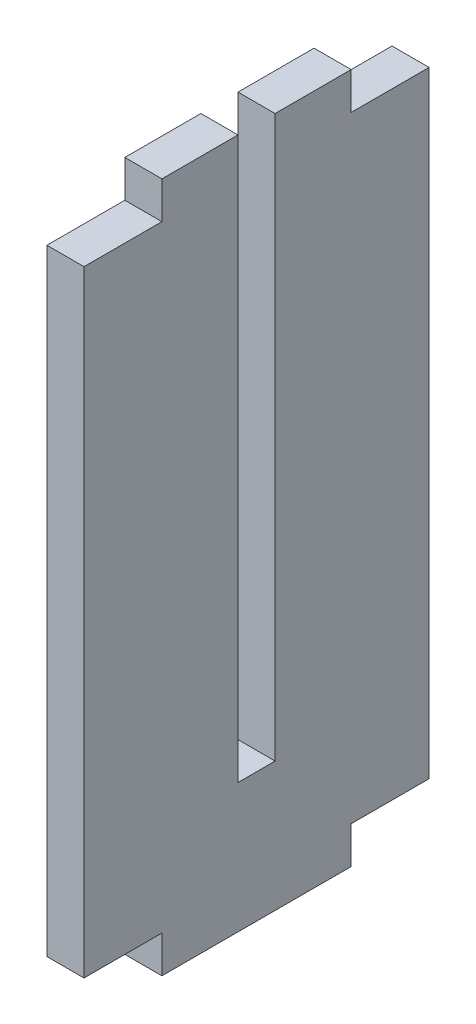
ISO-10303-21;
HEADER;
FILE_DESCRIPTION(('STEP AP214'),'2;1');
FILE_NAME('part.step','',(''),(''),'','','');
FILE_SCHEMA(('AUTOMOTIVE_DESIGN { 1 0 10303 214 1 1 1 1 }'));
ENDSEC;
DATA;
#1=APPLICATION_CONTEXT('core data for automotive mechanical design processes');
#2=APPLICATION_PROTOCOL_DEFINITION('international standard','automotive_design',2000,#1);
#3=PRODUCT_CONTEXT('',#1,'mechanical');
#4=PRODUCT('Part','Part','',(#3));
#5=PRODUCT_RELATED_PRODUCT_CATEGORY('part','',(#4));
#6=PRODUCT_DEFINITION_FORMATION('','',#4);
#7=PRODUCT_DEFINITION_CONTEXT('part definition',#1,'design');
#8=PRODUCT_DEFINITION('design','',#6,#7);
#9=PRODUCT_DEFINITION_SHAPE('','',#8);
#10=(LENGTH_UNIT() NAMED_UNIT(*) SI_UNIT(.MILLI.,.METRE.));
#11=(NAMED_UNIT(*) PLANE_ANGLE_UNIT() SI_UNIT($,.RADIAN.));
#12=(NAMED_UNIT(*) SI_UNIT($,.STERADIAN.) SOLID_ANGLE_UNIT());
#13=UNCERTAINTY_MEASURE_WITH_UNIT(LENGTH_MEASURE(1.E-05),#10,'distance_accuracy_value','');
#14=(GEOMETRIC_REPRESENTATION_CONTEXT(3) GLOBAL_UNCERTAINTY_ASSIGNED_CONTEXT((#13)) GLOBAL_UNIT_ASSIGNED_CONTEXT((#10,
#11,#12)) REPRESENTATION_CONTEXT('',''));
#15=CARTESIAN_POINT('',(0.,0.,0.));
#16=DIRECTION('',(0.,0.,1.));
#17=DIRECTION('',(1.,0.,0.));
#18=AXIS2_PLACEMENT_3D('',#15,#16,#17);
#19=CARTESIAN_POINT('',(5.461,101.6,0.));
#20=DIRECTION('',(0.,-1.,0.));
#21=DIRECTION('',(0.,0.,-1.));
#22=AXIS2_PLACEMENT_3D('',#19,#20,#21);
#23=PLANE('',#22);
#24=DIRECTION('',(0.,0.,1.));
#25=VECTOR('',#24,1.);
#26=CARTESIAN_POINT('',(0.,101.6,0.));
#27=LINE('',#26,#25);
#28=CARTESIAN_POINT('',(0.,101.6,-22.6695));
#29=VERTEX_POINT('',#28);
#30=CARTESIAN_POINT('',(0.,101.6,-11.4723333333333));
#31=VERTEX_POINT('',#30);
#32=EDGE_CURVE('E42',#29,#31,#27,.T.);
#33=ORIENTED_EDGE('',*,*,#32,.T.);
#34=DIRECTION('',(1.,0.,0.));
#35=VECTOR('',#34,1.);
#36=CARTESIAN_POINT('',(0.,101.6,-11.4723333333333));
#37=LINE('',#36,#35);
#38=CARTESIAN_POINT('',(5.461,101.6,-11.4723333333333));
#39=VERTEX_POINT('',#38);
#40=EDGE_CURVE('E272',#31,#39,#37,.T.);
#41=ORIENTED_EDGE('',*,*,#40,.T.);
#42=DIRECTION('',(0.,0.,1.));
#43=VECTOR('',#42,1.);
#44=CARTESIAN_POINT('',(5.461,101.6,0.));
#45=LINE('',#44,#43);
#46=CARTESIAN_POINT('',(5.461,101.6,-22.6695));
#47=VERTEX_POINT('',#46);
#48=EDGE_CURVE('E48',#47,#39,#45,.T.);
#49=ORIENTED_EDGE('',*,*,#48,.F.);
#50=DIRECTION('',(1.,0.,0.));
#51=VECTOR('',#50,1.);
#52=CARTESIAN_POINT('',(0.,101.6,-22.6695));
#53=LINE('',#52,#51);
#54=EDGE_CURVE('E200',#29,#47,#53,.T.);
#55=ORIENTED_EDGE('',*,*,#54,.F.);
#56=EDGE_LOOP('',(#33,#41,#49,#55));
#57=FACE_BOUND('',#56,.T.);
#58=ADVANCED_FACE('F38',(#57),#23,.F.);
#59=CARTESIAN_POINT('',(5.461,0.,0.));
#60=DIRECTION('',(0.,0.,-1.));
#61=DIRECTION('',(-1.,0.,0.));
#62=AXIS2_PLACEMENT_3D('',#59,#60,#61);
#63=PLANE('',#62);
#64=DIRECTION('',(0.,-1.,0.));
#65=VECTOR('',#64,1.);
#66=CARTESIAN_POINT('',(5.461,0.,0.));
#67=LINE('',#66,#65);
#68=CARTESIAN_POINT('',(5.461,96.139,0.));
#69=VERTEX_POINT('',#68);
#70=CARTESIAN_POINT('',(5.461,5.461,0.));
#71=VERTEX_POINT('',#70);
#72=EDGE_CURVE('E178',#69,#71,#67,.T.);
#73=ORIENTED_EDGE('',*,*,#72,.F.);
#74=DIRECTION('',(1.,0.,0.));
#75=VECTOR('',#74,1.);
#76=CARTESIAN_POINT('',(0.,96.139,0.));
#77=LINE('',#76,#75);
#78=CARTESIAN_POINT('',(0.,96.139,0.));
#79=VERTEX_POINT('',#78);
#80=EDGE_CURVE('E262',#79,#69,#77,.T.);
#81=ORIENTED_EDGE('',*,*,#80,.F.);
#82=DIRECTION('',(0.,-1.,0.));
#83=VECTOR('',#82,1.);
#84=CARTESIAN_POINT('',(0.,0.,0.));
#85=LINE('',#84,#83);
#86=CARTESIAN_POINT('',(0.,5.461,0.));
#87=VERTEX_POINT('',#86);
#88=EDGE_CURVE('E196',#79,#87,#85,.T.);
#89=ORIENTED_EDGE('',*,*,#88,.T.);
#90=DIRECTION('',(1.,0.,0.));
#91=VECTOR('',#90,1.);
#92=CARTESIAN_POINT('',(0.,5.461,0.));
#93=LINE('',#92,#91);
#94=EDGE_CURVE('E249',#87,#71,#93,.T.);
#95=ORIENTED_EDGE('',*,*,#94,.T.);
#96=EDGE_LOOP('',(#73,#81,#89,#95));
#97=FACE_BOUND('',#96,.T.);
#98=ADVANCED_FACE('F40',(#97),#63,.F.);
#99=CARTESIAN_POINT('',(5.461,0.,0.));
#100=DIRECTION('',(0.,1.,0.));
#101=DIRECTION('',(0.,0.,1.));
#102=AXIS2_PLACEMENT_3D('',#99,#100,#101);
#103=PLANE('',#102);
#104=DIRECTION('',(0.,0.,-1.));
#105=VECTOR('',#104,1.);
#106=CARTESIAN_POINT('',(0.,0.,0.));
#107=LINE('',#106,#105);
#108=CARTESIAN_POINT('',(0.,0.,-11.4723333333333));
#109=VERTEX_POINT('',#108);
#110=CARTESIAN_POINT('',(0.,0.,-39.3276666666667));
#111=VERTEX_POINT('',#110);
#112=EDGE_CURVE('E190',#109,#111,#107,.T.);
#113=ORIENTED_EDGE('',*,*,#112,.T.);
#114=DIRECTION('',(1.,0.,0.));
#115=VECTOR('',#114,1.);
#116=CARTESIAN_POINT('',(0.,0.,-39.3276666666667));
#117=LINE('',#116,#115);
#118=CARTESIAN_POINT('',(5.461,0.,-39.3276666666667));
#119=VERTEX_POINT('',#118);
#120=EDGE_CURVE('E268',#111,#119,#117,.T.);
#121=ORIENTED_EDGE('',*,*,#120,.T.);
#122=DIRECTION('',(0.,0.,-1.));
#123=VECTOR('',#122,1.);
#124=CARTESIAN_POINT('',(5.461,0.,0.));
#125=LINE('',#124,#123);
#126=CARTESIAN_POINT('',(5.461,0.,-11.4723333333333));
#127=VERTEX_POINT('',#126);
#128=EDGE_CURVE('E181',#127,#119,#125,.T.);
#129=ORIENTED_EDGE('',*,*,#128,.F.);
#130=DIRECTION('',(1.,0.,0.));
#131=VECTOR('',#130,1.);
#132=CARTESIAN_POINT('',(0.,0.,-11.4723333333333));
#133=LINE('',#132,#131);
#134=EDGE_CURVE('E255',#109,#127,#133,.T.);
#135=ORIENTED_EDGE('',*,*,#134,.F.);
#136=EDGE_LOOP('',(#113,#121,#129,#135));
#137=FACE_BOUND('',#136,.T.);
#138=ADVANCED_FACE('F359',(#137),#103,.F.);
#139=CARTESIAN_POINT('',(5.461,0.,-50.8));
#140=DIRECTION('',(0.,0.,1.));
#141=DIRECTION('',(1.,0.,0.));
#142=AXIS2_PLACEMENT_3D('',#139,#140,#141);
#143=PLANE('',#142);
#144=DIRECTION('',(0.,1.,0.));
#145=VECTOR('',#144,1.);
#146=CARTESIAN_POINT('',(5.461,0.,-50.8));
#147=LINE('',#146,#145);
#148=CARTESIAN_POINT('',(5.461,5.461,-50.8));
#149=VERTEX_POINT('',#148);
#150=CARTESIAN_POINT('',(5.461,96.139,-50.8));
#151=VERTEX_POINT('',#150);
#152=EDGE_CURVE('E205',#149,#151,#147,.T.);
#153=ORIENTED_EDGE('',*,*,#152,.F.);
#154=DIRECTION('',(1.,0.,0.));
#155=VECTOR('',#154,1.);
#156=CARTESIAN_POINT('',(0.,5.461,-50.8));
#157=LINE('',#156,#155);
#158=CARTESIAN_POINT('',(0.,5.461,-50.8));
#159=VERTEX_POINT('',#158);
#160=EDGE_CURVE('E283',#159,#149,#157,.T.);
#161=ORIENTED_EDGE('',*,*,#160,.F.);
#162=DIRECTION('',(0.,1.,0.));
#163=VECTOR('',#162,1.);
#164=CARTESIAN_POINT('',(0.,0.,-50.8));
#165=LINE('',#164,#163);
#166=CARTESIAN_POINT('',(0.,96.139,-50.8));
#167=VERTEX_POINT('',#166);
#168=EDGE_CURVE('E184',#159,#167,#165,.T.);
#169=ORIENTED_EDGE('',*,*,#168,.T.);
#170=DIRECTION('',(1.,0.,0.));
#171=VECTOR('',#170,1.);
#172=CARTESIAN_POINT('',(0.,96.139,-50.8));
#173=LINE('',#172,#171);
#174=EDGE_CURVE('E289',#167,#151,#173,.T.);
#175=ORIENTED_EDGE('',*,*,#174,.T.);
#176=EDGE_LOOP('',(#153,#161,#169,#175));
#177=FACE_BOUND('',#176,.T.);
#178=ADVANCED_FACE('F363',(#177),#143,.F.);
#179=CARTESIAN_POINT('',(5.461,101.6,-39.3276666666667));
#180=VERTEX_POINT('',#179);
#181=CARTESIAN_POINT('',(5.461,101.6,-28.1305));
#182=VERTEX_POINT('',#181);
#183=EDGE_CURVE('E12',#180,#182,#45,.T.);
#184=ORIENTED_EDGE('',*,*,#183,.F.);
#185=DIRECTION('',(1.,0.,0.));
#186=VECTOR('',#185,1.);
#187=CARTESIAN_POINT('',(0.,101.6,-39.3276666666667));
#188=LINE('',#187,#186);
#189=CARTESIAN_POINT('',(0.,101.6,-39.3276666666667));
#190=VERTEX_POINT('',#189);
#191=EDGE_CURVE('E158',#190,#180,#188,.T.);
#192=ORIENTED_EDGE('',*,*,#191,.F.);
#193=CARTESIAN_POINT('',(0.,101.6,-28.1305));
#194=VERTEX_POINT('',#193);
#195=EDGE_CURVE('E172',#190,#194,#27,.T.);
#196=ORIENTED_EDGE('',*,*,#195,.T.);
#197=DIRECTION('',(1.,0.,0.));
#198=VECTOR('',#197,1.);
#199=CARTESIAN_POINT('',(0.,101.6,-28.1305));
#200=LINE('',#199,#198);
#201=EDGE_CURVE('E226',#194,#182,#200,.T.);
#202=ORIENTED_EDGE('',*,*,#201,.T.);
#203=EDGE_LOOP('',(#184,#192,#196,#202));
#204=FACE_BOUND('',#203,.T.);
#205=ADVANCED_FACE('F170',(#204),#23,.F.);
#206=CARTESIAN_POINT('',(5.461,0.,0.));
#207=DIRECTION('',(-1.,0.,0.));
#208=DIRECTION('',(0.,0.,1.));
#209=AXIS2_PLACEMENT_3D('',#206,#207,#208);
#210=PLANE('',#209);
#211=ORIENTED_EDGE('',*,*,#48,.T.);
#212=DIRECTION('',(0.,1.,0.));
#213=VECTOR('',#212,1.);
#214=CARTESIAN_POINT('',(5.461,101.6,-11.4723333333333));
#215=LINE('',#214,#213);
#216=CARTESIAN_POINT('',(5.461,96.139,-11.4723333333333));
#217=VERTEX_POINT('',#216);
#218=EDGE_CURVE('E261',#217,#39,#215,.T.);
#219=ORIENTED_EDGE('',*,*,#218,.F.);
#220=DIRECTION('',(0.,0.,-1.));
#221=VECTOR('',#220,1.);
#222=CARTESIAN_POINT('',(5.461,96.139,0.));
#223=LINE('',#222,#221);
#224=EDGE_CURVE('E263',#69,#217,#223,.T.);
#225=ORIENTED_EDGE('',*,*,#224,.F.);
#226=ORIENTED_EDGE('',*,*,#72,.T.);
#227=DIRECTION('',(0.,0.,1.));
#228=VECTOR('',#227,1.);
#229=CARTESIAN_POINT('',(5.461,5.461,0.));
#230=LINE('',#229,#228);
#231=CARTESIAN_POINT('',(5.461,5.461,-11.4723333333333));
#232=VERTEX_POINT('',#231);
#233=EDGE_CURVE('E241',#232,#71,#230,.T.);
#234=ORIENTED_EDGE('',*,*,#233,.F.);
#235=DIRECTION('',(0.,1.,0.));
#236=VECTOR('',#235,1.);
#237=CARTESIAN_POINT('',(5.461,0.,-11.4723333333333));
#238=LINE('',#237,#236);
#239=EDGE_CURVE('E246',#127,#232,#238,.T.);
#240=ORIENTED_EDGE('',*,*,#239,.F.);
#241=ORIENTED_EDGE('',*,*,#128,.T.);
#242=DIRECTION('',(0.,-1.,0.));
#243=VECTOR('',#242,1.);
#244=CARTESIAN_POINT('',(5.461,0.,-39.3276666666667));
#245=LINE('',#244,#243);
#246=CARTESIAN_POINT('',(5.461,5.46099999999998,-39.3276666666667));
#247=VERTEX_POINT('',#246);
#248=EDGE_CURVE('E281',#247,#119,#245,.T.);
#249=ORIENTED_EDGE('',*,*,#248,.F.);
#250=DIRECTION('',(0.,0.,1.));
#251=VECTOR('',#250,1.);
#252=CARTESIAN_POINT('',(5.461,5.461,-50.8));
#253=LINE('',#252,#251);
#254=EDGE_CURVE('E284',#149,#247,#253,.T.);
#255=ORIENTED_EDGE('',*,*,#254,.F.);
#256=ORIENTED_EDGE('',*,*,#152,.T.);
#257=DIRECTION('',(0.,0.,-1.));
#258=VECTOR('',#257,1.);
#259=CARTESIAN_POINT('',(5.461,96.139,-50.8));
#260=LINE('',#259,#258);
#261=CARTESIAN_POINT('',(5.461,96.139,-39.3276666666667));
#262=VERTEX_POINT('',#261);
#263=EDGE_CURVE('E165',#262,#151,#260,.T.);
#264=ORIENTED_EDGE('',*,*,#263,.F.);
#265=DIRECTION('',(0.,-1.,0.));
#266=VECTOR('',#265,1.);
#267=CARTESIAN_POINT('',(5.461,101.6,-39.3276666666667));
#268=LINE('',#267,#266);
#269=EDGE_CURVE('E252',#180,#262,#268,.T.);
#270=ORIENTED_EDGE('',*,*,#269,.F.);
#271=ORIENTED_EDGE('',*,*,#183,.T.);
#272=DIRECTION('',(0.,1.,0.));
#273=VECTOR('',#272,1.);
#274=CARTESIAN_POINT('',(5.461,101.6,-28.1305));
#275=LINE('',#274,#273);
#276=CARTESIAN_POINT('',(5.461,19.05,-28.1305));
#277=VERTEX_POINT('',#276);
#278=EDGE_CURVE('E218',#277,#182,#275,.T.);
#279=ORIENTED_EDGE('',*,*,#278,.F.);
#280=DIRECTION('',(0.,0.,-1.));
#281=VECTOR('',#280,1.);
#282=CARTESIAN_POINT('',(5.461,19.05,-22.6695));
#283=LINE('',#282,#281);
#284=CARTESIAN_POINT('',(5.461,19.05,-22.6695));
#285=VERTEX_POINT('',#284);
#286=EDGE_CURVE('E223',#285,#277,#283,.T.);
#287=ORIENTED_EDGE('',*,*,#286,.F.);
#288=DIRECTION('',(0.,-1.,0.));
#289=VECTOR('',#288,1.);
#290=CARTESIAN_POINT('',(5.461,101.6,-22.6695));
#291=LINE('',#290,#289);
#292=EDGE_CURVE('E274',#47,#285,#291,.T.);
#293=ORIENTED_EDGE('',*,*,#292,.F.);
#294=EDGE_LOOP('',(#211,#219,#225,#226,#234,#240,#241,#249,#255,#256,#264,#270,#271,#279,#287,#293));
#295=FACE_BOUND('',#294,.T.);
#296=ADVANCED_FACE('F317',(#295),#210,.F.);
#297=CARTESIAN_POINT('',(0.,0.,0.));
#298=DIRECTION('',(-1.,0.,0.));
#299=DIRECTION('',(0.,0.,1.));
#300=AXIS2_PLACEMENT_3D('',#297,#298,#299);
#301=PLANE('',#300);
#302=DIRECTION('',(0.,1.,0.));
#303=VECTOR('',#302,1.);
#304=CARTESIAN_POINT('',(0.,101.6,-11.4723333333333));
#305=LINE('',#304,#303);
#306=CARTESIAN_POINT('',(0.,96.139,-11.4723333333333));
#307=VERTEX_POINT('',#306);
#308=EDGE_CURVE('E56',#307,#31,#305,.T.);
#309=ORIENTED_EDGE('',*,*,#308,.T.);
#310=ORIENTED_EDGE('',*,*,#32,.F.);
#311=DIRECTION('',(0.,-1.,0.));
#312=VECTOR('',#311,1.);
#313=CARTESIAN_POINT('',(0.,101.6,-22.6695));
#314=LINE('',#313,#312);
#315=CARTESIAN_POINT('',(0.,19.05,-22.6695));
#316=VERTEX_POINT('',#315);
#317=EDGE_CURVE('E222',#29,#316,#314,.T.);
#318=ORIENTED_EDGE('',*,*,#317,.T.);
#319=DIRECTION('',(0.,0.,-1.));
#320=VECTOR('',#319,1.);
#321=CARTESIAN_POINT('',(0.,19.05,-22.6695));
#322=LINE('',#321,#320);
#323=CARTESIAN_POINT('',(0.,19.05,-28.1305));
#324=VERTEX_POINT('',#323);
#325=EDGE_CURVE('E326',#316,#324,#322,.T.);
#326=ORIENTED_EDGE('',*,*,#325,.T.);
#327=DIRECTION('',(0.,1.,0.));
#328=VECTOR('',#327,1.);
#329=CARTESIAN_POINT('',(0.,101.6,-28.1305));
#330=LINE('',#329,#328);
#331=EDGE_CURVE('E177',#324,#194,#330,.T.);
#332=ORIENTED_EDGE('',*,*,#331,.T.);
#333=ORIENTED_EDGE('',*,*,#195,.F.);
#334=DIRECTION('',(0.,-1.,0.));
#335=VECTOR('',#334,1.);
#336=CARTESIAN_POINT('',(0.,101.6,-39.3276666666667));
#337=LINE('',#336,#335);
#338=CARTESIAN_POINT('',(0.,96.139,-39.3276666666667));
#339=VERTEX_POINT('',#338);
#340=EDGE_CURVE('E154',#190,#339,#337,.T.);
#341=ORIENTED_EDGE('',*,*,#340,.T.);
#342=DIRECTION('',(0.,0.,-1.));
#343=VECTOR('',#342,1.);
#344=CARTESIAN_POINT('',(0.,96.139,-50.8));
#345=LINE('',#344,#343);
#346=EDGE_CURVE('E164',#339,#167,#345,.T.);
#347=ORIENTED_EDGE('',*,*,#346,.T.);
#348=ORIENTED_EDGE('',*,*,#168,.F.);
#349=DIRECTION('',(0.,0.,1.));
#350=VECTOR('',#349,1.);
#351=CARTESIAN_POINT('',(0.,5.461,-50.8));
#352=LINE('',#351,#350);
#353=CARTESIAN_POINT('',(0.,5.46099999999998,-39.3276666666667));
#354=VERTEX_POINT('',#353);
#355=EDGE_CURVE('E278',#159,#354,#352,.T.);
#356=ORIENTED_EDGE('',*,*,#355,.T.);
#357=DIRECTION('',(0.,-1.,0.));
#358=VECTOR('',#357,1.);
#359=CARTESIAN_POINT('',(0.,0.,-39.3276666666667));
#360=LINE('',#359,#358);
#361=EDGE_CURVE('E64',#354,#111,#360,.T.);
#362=ORIENTED_EDGE('',*,*,#361,.T.);
#363=ORIENTED_EDGE('',*,*,#112,.F.);
#364=DIRECTION('',(0.,1.,0.));
#365=VECTOR('',#364,1.);
#366=CARTESIAN_POINT('',(0.,0.,-11.4723333333333));
#367=LINE('',#366,#365);
#368=CARTESIAN_POINT('',(0.,5.461,-11.4723333333333));
#369=VERTEX_POINT('',#368);
#370=EDGE_CURVE('E245',#109,#369,#367,.T.);
#371=ORIENTED_EDGE('',*,*,#370,.T.);
#372=DIRECTION('',(0.,0.,1.));
#373=VECTOR('',#372,1.);
#374=CARTESIAN_POINT('',(0.,5.461,0.));
#375=LINE('',#374,#373);
#376=EDGE_CURVE('E257',#369,#87,#375,.T.);
#377=ORIENTED_EDGE('',*,*,#376,.T.);
#378=ORIENTED_EDGE('',*,*,#88,.F.);
#379=DIRECTION('',(0.,0.,-1.));
#380=VECTOR('',#379,1.);
#381=CARTESIAN_POINT('',(0.,96.139,0.));
#382=LINE('',#381,#380);
#383=EDGE_CURVE('E258',#79,#307,#382,.T.);
#384=ORIENTED_EDGE('',*,*,#383,.T.);
#385=EDGE_LOOP('',(#309,#310,#318,#326,#332,#333,#341,#347,#348,#356,#362,#363,#371,#377,#378,#384));
#386=FACE_BOUND('',#385,.T.);
#387=ADVANCED_FACE('F175',(#386),#301,.T.);
#388=CARTESIAN_POINT('',(0.,101.6,-22.6695));
#389=DIRECTION('',(0.,0.,1.));
#390=DIRECTION('',(1.,0.,0.));
#391=AXIS2_PLACEMENT_3D('',#388,#389,#390);
#392=PLANE('',#391);
#393=ORIENTED_EDGE('',*,*,#292,.T.);
#394=DIRECTION('',(1.,0.,0.));
#395=VECTOR('',#394,1.);
#396=CARTESIAN_POINT('',(0.,19.05,-22.6695));
#397=LINE('',#396,#395);
#398=EDGE_CURVE('E230',#316,#285,#397,.T.);
#399=ORIENTED_EDGE('',*,*,#398,.F.);
#400=ORIENTED_EDGE('',*,*,#317,.F.);
#401=ORIENTED_EDGE('',*,*,#54,.T.);
#402=EDGE_LOOP('',(#393,#399,#400,#401));
#403=FACE_BOUND('',#402,.T.);
#404=ADVANCED_FACE('F344',(#403),#392,.F.);
#405=CARTESIAN_POINT('',(0.,101.6,-28.1305));
#406=DIRECTION('',(0.,0.,-1.));
#407=DIRECTION('',(-1.,0.,0.));
#408=AXIS2_PLACEMENT_3D('',#405,#406,#407);
#409=PLANE('',#408);
#410=ORIENTED_EDGE('',*,*,#278,.T.);
#411=ORIENTED_EDGE('',*,*,#201,.F.);
#412=ORIENTED_EDGE('',*,*,#331,.F.);
#413=DIRECTION('',(1.,0.,0.));
#414=VECTOR('',#413,1.);
#415=CARTESIAN_POINT('',(0.,19.05,-28.1305));
#416=LINE('',#415,#414);
#417=EDGE_CURVE('E228',#324,#277,#416,.T.);
#418=ORIENTED_EDGE('',*,*,#417,.T.);
#419=EDGE_LOOP('',(#410,#411,#412,#418));
#420=FACE_BOUND('',#419,.T.);
#421=ADVANCED_FACE('F342',(#420),#409,.F.);
#422=CARTESIAN_POINT('',(0.,19.05,-22.6695));
#423=DIRECTION('',(0.,-1.,0.));
#424=DIRECTION('',(0.,0.,-1.));
#425=AXIS2_PLACEMENT_3D('',#422,#423,#424);
#426=PLANE('',#425);
#427=ORIENTED_EDGE('',*,*,#286,.T.);
#428=ORIENTED_EDGE('',*,*,#417,.F.);
#429=ORIENTED_EDGE('',*,*,#325,.F.);
#430=ORIENTED_EDGE('',*,*,#398,.T.);
#431=EDGE_LOOP('',(#427,#428,#429,#430));
#432=FACE_BOUND('',#431,.T.);
#433=ADVANCED_FACE('F340',(#432),#426,.F.);
#434=CARTESIAN_POINT('',(0.,5.461,0.));
#435=DIRECTION('',(0.,1.,0.));
#436=DIRECTION('',(0.,0.,1.));
#437=AXIS2_PLACEMENT_3D('',#434,#435,#436);
#438=PLANE('',#437);
#439=ORIENTED_EDGE('',*,*,#233,.T.);
#440=ORIENTED_EDGE('',*,*,#94,.F.);
#441=ORIENTED_EDGE('',*,*,#376,.F.);
#442=DIRECTION('',(1.,0.,0.));
#443=VECTOR('',#442,1.);
#444=CARTESIAN_POINT('',(0.,5.461,-11.4723333333333));
#445=LINE('',#444,#443);
#446=EDGE_CURVE('E253',#369,#232,#445,.T.);
#447=ORIENTED_EDGE('',*,*,#446,.T.);
#448=EDGE_LOOP('',(#439,#440,#441,#447));
#449=FACE_BOUND('',#448,.T.);
#450=ADVANCED_FACE('F350',(#449),#438,.F.);
#451=CARTESIAN_POINT('',(0.,0.,-11.4723333333333));
#452=DIRECTION('',(0.,0.,-1.));
#453=DIRECTION('',(-1.,0.,0.));
#454=AXIS2_PLACEMENT_3D('',#451,#452,#453);
#455=PLANE('',#454);
#456=ORIENTED_EDGE('',*,*,#239,.T.);
#457=ORIENTED_EDGE('',*,*,#446,.F.);
#458=ORIENTED_EDGE('',*,*,#370,.F.);
#459=ORIENTED_EDGE('',*,*,#134,.T.);
#460=EDGE_LOOP('',(#456,#457,#458,#459));
#461=FACE_BOUND('',#460,.T.);
#462=ADVANCED_FACE('F395',(#461),#455,.F.);
#463=CARTESIAN_POINT('',(0.,96.139,-50.8));
#464=DIRECTION('',(0.,-1.,0.));
#465=DIRECTION('',(0.,0.,-1.));
#466=AXIS2_PLACEMENT_3D('',#463,#464,#465);
#467=PLANE('',#466);
#468=ORIENTED_EDGE('',*,*,#263,.T.);
#469=ORIENTED_EDGE('',*,*,#174,.F.);
#470=ORIENTED_EDGE('',*,*,#346,.F.);
#471=DIRECTION('',(1.,0.,0.));
#472=VECTOR('',#471,1.);
#473=CARTESIAN_POINT('',(0.,96.139,-39.3276666666667));
#474=LINE('',#473,#472);
#475=EDGE_CURVE('E160',#339,#262,#474,.T.);
#476=ORIENTED_EDGE('',*,*,#475,.T.);
#477=EDGE_LOOP('',(#468,#469,#470,#476));
#478=FACE_BOUND('',#477,.T.);
#479=ADVANCED_FACE('F392',(#478),#467,.F.);
#480=CARTESIAN_POINT('',(0.,101.6,-39.3276666666667));
#481=DIRECTION('',(0.,0.,1.));
#482=DIRECTION('',(1.,0.,0.));
#483=AXIS2_PLACEMENT_3D('',#480,#481,#482);
#484=PLANE('',#483);
#485=ORIENTED_EDGE('',*,*,#269,.T.);
#486=ORIENTED_EDGE('',*,*,#475,.F.);
#487=ORIENTED_EDGE('',*,*,#340,.F.);
#488=ORIENTED_EDGE('',*,*,#191,.T.);
#489=EDGE_LOOP('',(#485,#486,#487,#488));
#490=FACE_BOUND('',#489,.T.);
#491=ADVANCED_FACE('F157',(#490),#484,.F.);
#492=CARTESIAN_POINT('',(0.,0.,-39.3276666666667));
#493=DIRECTION('',(0.,0.,1.));
#494=DIRECTION('',(1.,0.,0.));
#495=AXIS2_PLACEMENT_3D('',#492,#493,#494);
#496=PLANE('',#495);
#497=ORIENTED_EDGE('',*,*,#248,.T.);
#498=ORIENTED_EDGE('',*,*,#120,.F.);
#499=ORIENTED_EDGE('',*,*,#361,.F.);
#500=DIRECTION('',(1.,0.,0.));
#501=VECTOR('',#500,1.);
#502=CARTESIAN_POINT('',(0.,5.46099999999998,-39.3276666666667));
#503=LINE('',#502,#501);
#504=EDGE_CURVE('E388',#354,#247,#503,.T.);
#505=ORIENTED_EDGE('',*,*,#504,.T.);
#506=EDGE_LOOP('',(#497,#498,#499,#505));
#507=FACE_BOUND('',#506,.T.);
#508=ADVANCED_FACE('F401',(#507),#496,.F.);
#509=CARTESIAN_POINT('',(0.,5.461,-50.8));
#510=DIRECTION('',(0.,1.,0.));
#511=DIRECTION('',(0.,0.,1.));
#512=AXIS2_PLACEMENT_3D('',#509,#510,#511);
#513=PLANE('',#512);
#514=ORIENTED_EDGE('',*,*,#254,.T.);
#515=ORIENTED_EDGE('',*,*,#504,.F.);
#516=ORIENTED_EDGE('',*,*,#355,.F.);
#517=ORIENTED_EDGE('',*,*,#160,.T.);
#518=EDGE_LOOP('',(#514,#515,#516,#517));
#519=FACE_BOUND('',#518,.T.);
#520=ADVANCED_FACE('F390',(#519),#513,.F.);
#521=CARTESIAN_POINT('',(0.,101.6,-11.4723333333333));
#522=DIRECTION('',(0.,0.,-1.));
#523=DIRECTION('',(-1.,0.,0.));
#524=AXIS2_PLACEMENT_3D('',#521,#522,#523);
#525=PLANE('',#524);
#526=ORIENTED_EDGE('',*,*,#218,.T.);
#527=ORIENTED_EDGE('',*,*,#40,.F.);
#528=ORIENTED_EDGE('',*,*,#308,.F.);
#529=DIRECTION('',(1.,0.,0.));
#530=VECTOR('',#529,1.);
#531=CARTESIAN_POINT('',(0.,96.139,-11.4723333333333));
#532=LINE('',#531,#530);
#533=EDGE_CURVE('E275',#307,#217,#532,.T.);
#534=ORIENTED_EDGE('',*,*,#533,.T.);
#535=EDGE_LOOP('',(#526,#527,#528,#534));
#536=FACE_BOUND('',#535,.T.);
#537=ADVANCED_FACE('F321',(#536),#525,.F.);
#538=CARTESIAN_POINT('',(0.,96.139,0.));
#539=DIRECTION('',(0.,-1.,0.));
#540=DIRECTION('',(0.,0.,-1.));
#541=AXIS2_PLACEMENT_3D('',#538,#539,#540);
#542=PLANE('',#541);
#543=ORIENTED_EDGE('',*,*,#224,.T.);
#544=ORIENTED_EDGE('',*,*,#533,.F.);
#545=ORIENTED_EDGE('',*,*,#383,.F.);
#546=ORIENTED_EDGE('',*,*,#80,.T.);
#547=EDGE_LOOP('',(#543,#544,#545,#546));
#548=FACE_BOUND('',#547,.T.);
#549=ADVANCED_FACE('F314',(#548),#542,.F.);
#550=CLOSED_SHELL('',(#58,#98,#138,#178,#205,#296,#387,#404,#421,#433,#450,#462,#479,#491,#508,
#520,#537,#549));
#551=MANIFOLD_SOLID_BREP('B2',#550);
#552=ADVANCED_BREP_SHAPE_REPRESENTATION('',(#18,#551),#14);
#553=SHAPE_DEFINITION_REPRESENTATION(#9,#552);
ENDSEC;
END-ISO-10303-21;
